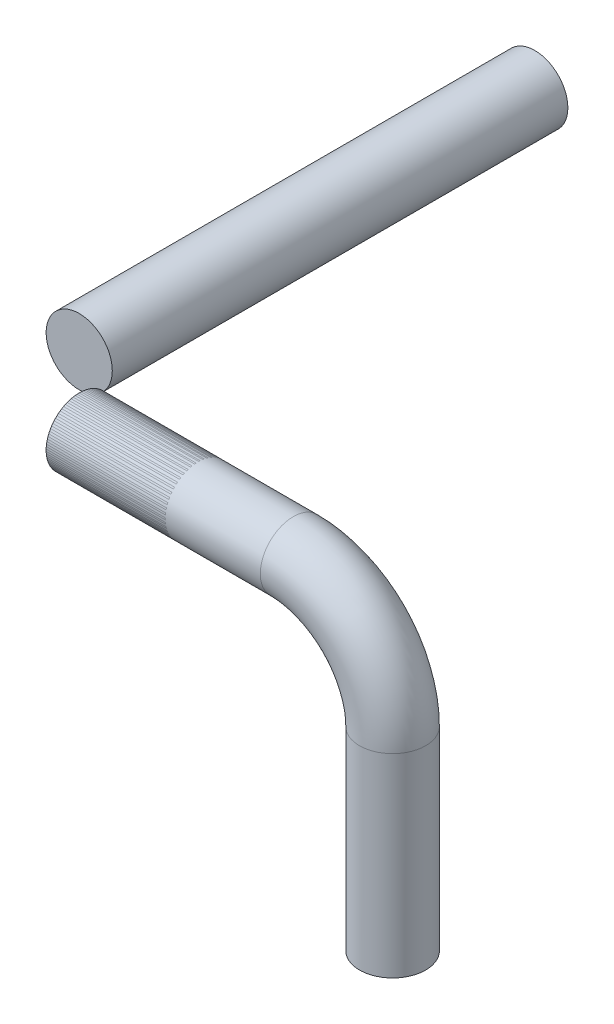
ISO-10303-21;
HEADER;
FILE_DESCRIPTION(('STEP AP214'),'2;1');
FILE_NAME('part.step','',(''),(''),'','','');
FILE_SCHEMA(('AUTOMOTIVE_DESIGN { 1 0 10303 214 1 1 1 1 }'));
ENDSEC;
DATA;
#1=APPLICATION_CONTEXT('core data for automotive mechanical design processes');
#2=APPLICATION_PROTOCOL_DEFINITION('international standard','automotive_design',2000,#1);
#3=PRODUCT_CONTEXT('',#1,'mechanical');
#4=PRODUCT('Part','Part','',(#3));
#5=PRODUCT_RELATED_PRODUCT_CATEGORY('part','',(#4));
#6=PRODUCT_DEFINITION_FORMATION('','',#4);
#7=PRODUCT_DEFINITION_CONTEXT('part definition',#1,'design');
#8=PRODUCT_DEFINITION('design','',#6,#7);
#9=PRODUCT_DEFINITION_SHAPE('','',#8);
#10=(LENGTH_UNIT() NAMED_UNIT(*) SI_UNIT(.MILLI.,.METRE.));
#11=(NAMED_UNIT(*) PLANE_ANGLE_UNIT() SI_UNIT($,.RADIAN.));
#12=(NAMED_UNIT(*) SI_UNIT($,.STERADIAN.) SOLID_ANGLE_UNIT());
#13=UNCERTAINTY_MEASURE_WITH_UNIT(LENGTH_MEASURE(1.E-05),#10,'distance_accuracy_value','');
#14=(GEOMETRIC_REPRESENTATION_CONTEXT(3) GLOBAL_UNCERTAINTY_ASSIGNED_CONTEXT((#13)) GLOBAL_UNIT_ASSIGNED_CONTEXT((#10,
#11,#12)) REPRESENTATION_CONTEXT('',''));
#15=CARTESIAN_POINT('',(0.,0.,0.));
#16=DIRECTION('',(0.,0.,1.));
#17=DIRECTION('',(1.,0.,0.));
#18=AXIS2_PLACEMENT_3D('',#15,#16,#17);
#19=CARTESIAN_POINT('',(0.,0.,84.0740000000007));
#20=DIRECTION('',(0.,0.,-1.));
#21=DIRECTION('',(-1.,0.,0.));
#22=AXIS2_PLACEMENT_3D('',#19,#20,#21);
#23=PLANE('',#22);
#24=CARTESIAN_POINT('',(0.,0.,84.0740000000007));
#25=DIRECTION('',(0.,0.,-1.));
#26=DIRECTION('',(-1.,0.,0.));
#27=AXIS2_PLACEMENT_3D('',#24,#25,#26);
#28=CIRCLE('',#27,6.35);
#29=CARTESIAN_POINT('',(-6.35,0.,84.0740000000007));
#30=VERTEX_POINT('',#29);
#31=EDGE_CURVE('E53',#30,#30,#28,.T.);
#32=ORIENTED_EDGE('',*,*,#31,.F.);
#33=EDGE_LOOP('',(#32));
#34=FACE_BOUND('',#33,.T.);
#35=ADVANCED_FACE('F46',(#34),#23,.F.);
#36=CARTESIAN_POINT('',(0.,0.,-21.3387122421383));
#37=DIRECTION('',(0.,0.,1.));
#38=DIRECTION('',(1.,0.,0.));
#39=AXIS2_PLACEMENT_3D('',#36,#37,#38);
#40=CYLINDRICAL_SURFACE('',#39,6.35);
#41=CARTESIAN_POINT('',(0.,0.,-3.37819999999999));
#42=DIRECTION('',(0.,0.,1.));
#43=DIRECTION('',(1.,0.,0.));
#44=AXIS2_PLACEMENT_3D('',#41,#42,#43);
#45=CIRCLE('',#44,6.35);
#46=CARTESIAN_POINT('',(6.35,0.,-3.37819999999999));
#47=VERTEX_POINT('',#46);
#48=EDGE_CURVE('E11',#47,#47,#45,.T.);
#49=ORIENTED_EDGE('',*,*,#48,.T.);
#50=EDGE_LOOP('',(#49));
#51=FACE_BOUND('',#50,.T.);
#52=ORIENTED_EDGE('',*,*,#31,.T.);
#53=EDGE_LOOP('',(#52));
#54=FACE_BOUND('',#53,.T.);
#55=ADVANCED_FACE('F48',(#51,#54),#40,.T.);
#56=CARTESIAN_POINT('',(0.,0.,-3.37819999999999));
#57=DIRECTION('',(0.,0.,1.));
#58=DIRECTION('',(1.,0.,0.));
#59=AXIS2_PLACEMENT_3D('',#56,#57,#58);
#60=PLANE('',#59);
#61=ORIENTED_EDGE('',*,*,#48,.F.);
#62=EDGE_LOOP('',(#61));
#63=FACE_BOUND('',#62,.T.);
#64=ADVANCED_FACE('F64',(#63),#60,.F.);
#65=CLOSED_SHELL('',(#35,#55,#64));
#66=MANIFOLD_SOLID_BREP('B2',#65);
#67=CARTESIAN_POINT('',(54.3147558894697,0.,97.2820000000001));
#68=DIRECTION('',(-1.,0.,0.));
#69=DIRECTION('',(0.,-1.,0.));
#70=AXIS2_PLACEMENT_3D('',#67,#68,#69);
#71=CYLINDRICAL_SURFACE('',#70,6.34999999999999);
#72=CARTESIAN_POINT('',(54.3147558894697,0.,97.2820000000001));
#73=DIRECTION('',(1.,0.,0.));
#74=DIRECTION('',(0.,0.,-1.));
#75=AXIS2_PLACEMENT_3D('',#72,#73,#74);
#76=CIRCLE('',#75,6.34999999999999);
#77=CARTESIAN_POINT('',(54.3147558894696,6.34999999999996,97.2820000000001));
#78=VERTEX_POINT('',#77);
#79=EDGE_CURVE('E101',#78,#78,#76,.T.);
#80=ORIENTED_EDGE('',*,*,#79,.F.);
#81=EDGE_LOOP('',(#80));
#82=FACE_BOUND('',#81,.T.);
#83=CARTESIAN_POINT('',(13.2080000000033,1.24410366923564E-12,97.2820000000001));
#84=DIRECTION('',(1.,0.,0.));
#85=DIRECTION('',(0.,0.,-1.));
#86=AXIS2_PLACEMENT_3D('',#83,#84,#85);
#87=CIRCLE('',#86,6.34999999999999);
#88=CARTESIAN_POINT('',(13.2080000000033,1.24410366923564E-12,90.9320000000001));
#89=VERTEX_POINT('',#88);
#90=EDGE_CURVE('E45',#89,#89,#87,.T.);
#91=ORIENTED_EDGE('',*,*,#90,.T.);
#92=EDGE_LOOP('',(#91));
#93=FACE_BOUND('',#92,.T.);
#94=ADVANCED_FACE('F95',(#82,#93),#71,.T.);
#95=CARTESIAN_POINT('',(54.3147558894698,-19.05,97.2820000000001));
#96=DIRECTION('',(0.,0.,1.));
#97=DIRECTION('',(1.,0.,0.));
#98=AXIS2_PLACEMENT_3D('',#95,#96,#97);
#99=TOROIDAL_SURFACE('',#98,19.05,6.34999999999999);
#100=CARTESIAN_POINT('',(73.3647558894698,-19.0500000000001,97.2820000000001));
#101=DIRECTION('',(0.,-1.,0.));
#102=DIRECTION('',(0.,0.,-1.));
#103=AXIS2_PLACEMENT_3D('',#100,#101,#102);
#104=CIRCLE('',#103,6.34999999999999);
#105=CARTESIAN_POINT('',(79.7147558894698,-19.0500000000002,97.2820000000001));
#106=VERTEX_POINT('',#105);
#107=EDGE_CURVE('E105',#106,#106,#104,.T.);
#108=CARTESIAN_POINT('',(54.3147558894698,-19.05,97.2820000000001));
#109=DIRECTION('',(0.,0.,1.));
#110=DIRECTION('',(1.,0.,0.));
#111=AXIS2_PLACEMENT_3D('',#108,#109,#110);
#112=CIRCLE('',#111,25.3999999999999);
#113=EDGE_CURVE('',#106,#78,#112,.T.);
#114=ORIENTED_EDGE('',*,*,#107,.F.);
#115=ORIENTED_EDGE('',*,*,#79,.T.);
#116=ORIENTED_EDGE('',*,*,#113,.T.);
#117=ORIENTED_EDGE('',*,*,#113,.F.);
#118=EDGE_LOOP('',(#114,#116,#115,#117));
#119=FACE_BOUND('',#118,.T.);
#120=ADVANCED_FACE('F120',(#119),#99,.T.);
#121=CARTESIAN_POINT('',(73.3647558894698,-19.0500000000001,97.2820000000001));
#122=DIRECTION('',(0.,-1.,0.));
#123=DIRECTION('',(0.,0.,-1.));
#124=AXIS2_PLACEMENT_3D('',#121,#122,#123);
#125=CYLINDRICAL_SURFACE('',#124,6.34999999999999);
#126=ORIENTED_EDGE('',*,*,#107,.T.);
#127=EDGE_LOOP('',(#126));
#128=FACE_BOUND('',#127,.T.);
#129=CARTESIAN_POINT('',(73.3647558894698,-56.3428997600009,97.2820000000001));
#130=DIRECTION('',(0.,-1.,0.));
#131=DIRECTION('',(0.,0.,-1.));
#132=AXIS2_PLACEMENT_3D('',#129,#130,#131);
#133=CIRCLE('',#132,6.34999999999999);
#134=CARTESIAN_POINT('',(73.3647558894698,-56.3428997600009,90.9320000000001));
#135=VERTEX_POINT('',#134);
#136=EDGE_CURVE('E109',#135,#135,#133,.T.);
#137=ORIENTED_EDGE('',*,*,#136,.F.);
#138=EDGE_LOOP('',(#137));
#139=FACE_BOUND('',#138,.T.);
#140=ADVANCED_FACE('F117',(#128,#139),#125,.T.);
#141=CARTESIAN_POINT('',(13.2080000000033,1.24410366923564E-12,97.2820000000001));
#142=DIRECTION('',(1.,0.,0.));
#143=DIRECTION('',(0.,0.,-1.));
#144=AXIS2_PLACEMENT_3D('',#141,#142,#143);
#145=PLANE('',#144);
#146=ORIENTED_EDGE('',*,*,#90,.F.);
#147=EDGE_LOOP('',(#146));
#148=FACE_BOUND('',#147,.T.);
#149=ADVANCED_FACE('F119',(#148),#145,.F.);
#150=CARTESIAN_POINT('',(73.3647558894698,-56.3428997600009,97.2820000000001));
#151=DIRECTION('',(0.,-1.,0.));
#152=DIRECTION('',(0.,0.,-1.));
#153=AXIS2_PLACEMENT_3D('',#150,#151,#152);
#154=PLANE('',#153);
#155=ORIENTED_EDGE('',*,*,#136,.T.);
#156=EDGE_LOOP('',(#155));
#157=FACE_BOUND('',#156,.T.);
#158=ADVANCED_FACE('F115',(#157),#154,.T.);
#159=CLOSED_SHELL('',(#94,#120,#140,#149,#158));
#160=MANIFOLD_SOLID_BREP('B6',#159);
#161=CARTESIAN_POINT('',(24.6380000000032,1.12583172896511E-12,97.2820000000007));
#162=DIRECTION('',(-1.,0.,0.));
#163=DIRECTION('',(0.,0.,1.));
#164=AXIS2_PLACEMENT_3D('',#161,#162,#163);
#165=CYLINDRICAL_SURFACE('',#164,6.35);
#166=CARTESIAN_POINT('',(36.0680000000032,1.29009988254845E-12,97.2820000000007));
#167=DIRECTION('',(-1.,0.,0.));
#168=DIRECTION('',(0.,0.,1.));
#169=AXIS2_PLACEMENT_3D('',#166,#167,#168);
#170=CIRCLE('',#169,6.35);
#171=CARTESIAN_POINT('',(36.0680000000032,1.28914679815938E-12,103.632000000001));
#172=VERTEX_POINT('',#171);
#173=EDGE_CURVE('E178',#172,#172,#170,.T.);
#174=ORIENTED_EDGE('',*,*,#173,.F.);
#175=EDGE_LOOP('',(#174));
#176=FACE_BOUND('',#175,.T.);
#177=CARTESIAN_POINT('',(13.2080000000032,9.6156357538177E-13,97.2820000000007));
#178=DIRECTION('',(-1.,0.,0.));
#179=DIRECTION('',(0.,0.,1.));
#180=AXIS2_PLACEMENT_3D('',#177,#178,#179);
#181=CIRCLE('',#180,6.35);
#182=CARTESIAN_POINT('',(13.2080000000032,9.60610490992699E-13,103.632000000001));
#183=VERTEX_POINT('',#182);
#184=EDGE_CURVE('E94',#183,#183,#181,.F.);
#185=ORIENTED_EDGE('',*,*,#184,.F.);
#186=EDGE_LOOP('',(#185));
#187=FACE_BOUND('',#186,.T.);
#188=ADVANCED_FACE('F174',(#176,#187),#165,.F.);
#189=OPEN_SHELL('',(#188));
#190=SHELL_BASED_SURFACE_MODEL('B40',(#189));
#191=ADVANCED_BREP_SHAPE_REPRESENTATION('',(#18,#66,#160),#14);
#192=MANIFOLD_SURFACE_SHAPE_REPRESENTATION('',(#18,#190),#14);
#193=SHAPE_REPRESENTATION('',(#18),#14);
#194=SHAPE_DEFINITION_REPRESENTATION(#9,#193);
#195=SHAPE_REPRESENTATION_RELATIONSHIP('','',#193,#191);
#196=SHAPE_REPRESENTATION_RELATIONSHIP('','',#193,#192);
ENDSEC;
END-ISO-10303-21;
